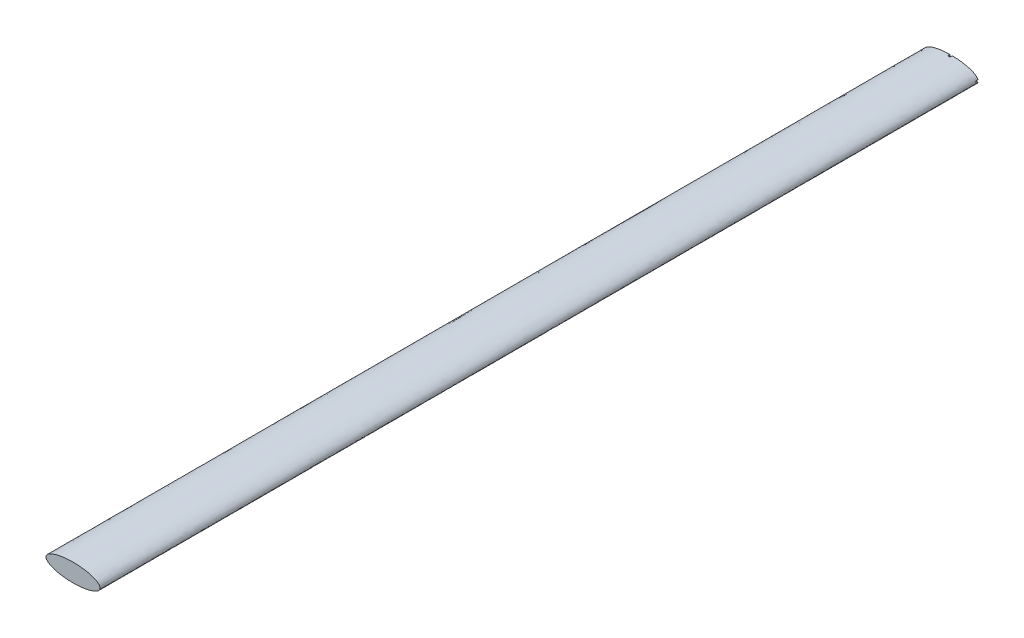
ISO-10303-21;
HEADER;
FILE_DESCRIPTION(('STEP AP214'),'2;1');
FILE_NAME('part.step','',(''),(''),'','','');
FILE_SCHEMA(('AUTOMOTIVE_DESIGN { 1 0 10303 214 1 1 1 1 }'));
ENDSEC;
DATA;
#1=APPLICATION_CONTEXT('core data for automotive mechanical design processes');
#2=APPLICATION_PROTOCOL_DEFINITION('international standard','automotive_design',2000,#1);
#3=PRODUCT_CONTEXT('',#1,'mechanical');
#4=PRODUCT('Part','Part','',(#3));
#5=PRODUCT_RELATED_PRODUCT_CATEGORY('part','',(#4));
#6=PRODUCT_DEFINITION_FORMATION('','',#4);
#7=PRODUCT_DEFINITION_CONTEXT('part definition',#1,'design');
#8=PRODUCT_DEFINITION('design','',#6,#7);
#9=PRODUCT_DEFINITION_SHAPE('','',#8);
#10=(LENGTH_UNIT() NAMED_UNIT(*) SI_UNIT(.MILLI.,.METRE.));
#11=(NAMED_UNIT(*) PLANE_ANGLE_UNIT() SI_UNIT($,.RADIAN.));
#12=(NAMED_UNIT(*) SI_UNIT($,.STERADIAN.) SOLID_ANGLE_UNIT());
#13=UNCERTAINTY_MEASURE_WITH_UNIT(LENGTH_MEASURE(1.E-05),#10,'distance_accuracy_value','');
#14=(GEOMETRIC_REPRESENTATION_CONTEXT(3) GLOBAL_UNCERTAINTY_ASSIGNED_CONTEXT((#13)) GLOBAL_UNIT_ASSIGNED_CONTEXT((#10,
#11,#12)) REPRESENTATION_CONTEXT('',''));
#15=CARTESIAN_POINT('',(0.,0.,0.));
#16=DIRECTION('',(0.,0.,1.));
#17=DIRECTION('',(1.,0.,0.));
#18=AXIS2_PLACEMENT_3D('',#15,#16,#17);
#19=CARTESIAN_POINT('',(0.,0.,0.));
#20=DIRECTION('',(0.,0.,1.));
#21=DIRECTION('',(1.,0.,0.));
#22=AXIS2_PLACEMENT_3D('',#19,#20,#21);
#23=PLANE('',#22);
#24=CARTESIAN_POINT('',(0.,0.,0.));
#25=DIRECTION('',(0.,0.,1.));
#26=DIRECTION('',(-1.,0.,0.));
#27=AXIS2_PLACEMENT_3D('',#24,#25,#26);
#28=ELLIPSE('',#27,12.,4.);
#29=CARTESIAN_POINT('',(11.9058808997907,0.5,0.));
#30=VERTEX_POINT('',#29);
#31=CARTESIAN_POINT('',(0.500000000000001,3.99652626942727,0.));
#32=VERTEX_POINT('',#31);
#33=EDGE_CURVE('E249',#30,#32,#28,.T.);
#34=ORIENTED_EDGE('',*,*,#33,.F.);
#35=DIRECTION('',(1.,0.,0.));
#36=VECTOR('',#35,1.);
#37=CARTESIAN_POINT('',(12.4063244461499,0.5,0.));
#38=LINE('',#37,#36);
#39=CARTESIAN_POINT('',(0.500000000000001,0.5,0.));
#40=VERTEX_POINT('',#39);
#41=EDGE_CURVE('E131',#40,#30,#38,.T.);
#42=ORIENTED_EDGE('',*,*,#41,.F.);
#43=DIRECTION('',(0.,1.,0.));
#44=VECTOR('',#43,1.);
#45=CARTESIAN_POINT('',(0.500000000000001,0.,0.));
#46=LINE('',#45,#44);
#47=EDGE_CURVE('E207',#40,#32,#46,.T.);
#48=ORIENTED_EDGE('',*,*,#47,.T.);
#49=EDGE_LOOP('',(#34,#42,#48));
#50=FACE_BOUND('',#49,.T.);
#51=ADVANCED_FACE('F33',(#50),#23,.F.);
#52=CARTESIAN_POINT('',(-0.499999999999999,3.99652626942727,0.));
#53=VERTEX_POINT('',#52);
#54=CARTESIAN_POINT('',(-11.9058808997907,0.5,0.));
#55=VERTEX_POINT('',#54);
#56=EDGE_CURVE('E192',#53,#55,#28,.T.);
#57=ORIENTED_EDGE('',*,*,#56,.F.);
#58=DIRECTION('',(0.,1.,0.));
#59=VECTOR('',#58,1.);
#60=CARTESIAN_POINT('',(-0.499999999999999,4.92349619167704,0.));
#61=LINE('',#60,#59);
#62=CARTESIAN_POINT('',(-0.499999999999999,0.5,0.));
#63=VERTEX_POINT('',#62);
#64=EDGE_CURVE('E164',#63,#53,#61,.T.);
#65=ORIENTED_EDGE('',*,*,#64,.F.);
#66=DIRECTION('',(-1.,0.,0.));
#67=VECTOR('',#66,1.);
#68=CARTESIAN_POINT('',(0.,0.5,0.));
#69=LINE('',#68,#67);
#70=EDGE_CURVE('E205',#63,#55,#69,.T.);
#71=ORIENTED_EDGE('',*,*,#70,.T.);
#72=EDGE_LOOP('',(#57,#65,#71));
#73=FACE_BOUND('',#72,.T.);
#74=ADVANCED_FACE('F236',(#73),#23,.F.);
#75=CARTESIAN_POINT('',(-11.9058808997907,-0.5,0.));
#76=VERTEX_POINT('',#75);
#77=CARTESIAN_POINT('',(-0.499999999999999,-3.99652626942727,0.));
#78=VERTEX_POINT('',#77);
#79=EDGE_CURVE('E197',#76,#78,#28,.T.);
#80=ORIENTED_EDGE('',*,*,#79,.F.);
#81=DIRECTION('',(-1.,0.,0.));
#82=VECTOR('',#81,1.);
#83=CARTESIAN_POINT('',(-0.499999999999999,-0.5,0.));
#84=LINE('',#83,#82);
#85=CARTESIAN_POINT('',(-0.499999999999999,-0.5,0.));
#86=VERTEX_POINT('',#85);
#87=EDGE_CURVE('E162',#86,#76,#84,.T.);
#88=ORIENTED_EDGE('',*,*,#87,.F.);
#89=DIRECTION('',(0.,-1.,0.));
#90=VECTOR('',#89,1.);
#91=CARTESIAN_POINT('',(-0.499999999999999,0.,0.));
#92=LINE('',#91,#90);
#93=EDGE_CURVE('E202',#86,#78,#92,.T.);
#94=ORIENTED_EDGE('',*,*,#93,.T.);
#95=EDGE_LOOP('',(#80,#88,#94));
#96=FACE_BOUND('',#95,.T.);
#97=ADVANCED_FACE('F226',(#96),#23,.F.);
#98=CARTESIAN_POINT('',(0.,0.,390.));
#99=DIRECTION('',(0.,0.,1.));
#100=DIRECTION('',(-1.,0.,0.));
#101=AXIS2_PLACEMENT_3D('',#98,#99,#100);
#102=ELLIPSE('',#101,12.,4.);
#103=DIRECTION('',(0.,0.,-1.));
#104=VECTOR('',#103,1.);
#105=SURFACE_OF_LINEAR_EXTRUSION('',#102,#104);
#106=ORIENTED_EDGE('',*,*,#33,.T.);
#107=DIRECTION('',(0.,0.,-1.));
#108=VECTOR('',#107,1.);
#109=CARTESIAN_POINT('',(0.500000000000001,3.99652626942727,390.));
#110=LINE('',#109,#108);
#111=CARTESIAN_POINT('',(0.500000000000001,3.99652626942727,1.));
#112=VERTEX_POINT('',#111);
#113=EDGE_CURVE('E189',#32,#112,#110,.F.);
#114=ORIENTED_EDGE('',*,*,#113,.T.);
#115=CARTESIAN_POINT('',(0.,0.,1.));
#116=DIRECTION('',(0.,0.,1.));
#117=DIRECTION('',(-1.,0.,0.));
#118=AXIS2_PLACEMENT_3D('',#115,#116,#117);
#119=ELLIPSE('',#118,12.,4.);
#120=CARTESIAN_POINT('',(-0.499999999999999,3.99652626942727,1.));
#121=VERTEX_POINT('',#120);
#122=EDGE_CURVE('E11',#121,#112,#119,.F.);
#123=ORIENTED_EDGE('',*,*,#122,.F.);
#124=DIRECTION('',(0.,0.,-1.));
#125=VECTOR('',#124,1.);
#126=CARTESIAN_POINT('',(-0.499999999999999,3.99652626942727,390.));
#127=LINE('',#126,#125);
#128=EDGE_CURVE('E186',#121,#53,#127,.T.);
#129=ORIENTED_EDGE('',*,*,#128,.T.);
#130=ORIENTED_EDGE('',*,*,#56,.T.);
#131=DIRECTION('',(0.,0.,-1.));
#132=VECTOR('',#131,1.);
#133=CARTESIAN_POINT('',(-11.9058808997907,0.5,390.));
#134=LINE('',#133,#132);
#135=CARTESIAN_POINT('',(-11.9058808997907,0.5,1.));
#136=VERTEX_POINT('',#135);
#137=EDGE_CURVE('E183',#55,#136,#134,.F.);
#138=ORIENTED_EDGE('',*,*,#137,.T.);
#139=CARTESIAN_POINT('',(-11.9058808997907,-0.5,1.));
#140=VERTEX_POINT('',#139);
#141=EDGE_CURVE('E38',#140,#136,#119,.F.);
#142=ORIENTED_EDGE('',*,*,#141,.F.);
#143=DIRECTION('',(0.,0.,-1.));
#144=VECTOR('',#143,1.);
#145=CARTESIAN_POINT('',(-11.9058808997907,-0.5,390.));
#146=LINE('',#145,#144);
#147=EDGE_CURVE('E180',#140,#76,#146,.T.);
#148=ORIENTED_EDGE('',*,*,#147,.T.);
#149=ORIENTED_EDGE('',*,*,#79,.T.);
#150=DIRECTION('',(0.,0.,-1.));
#151=VECTOR('',#150,1.);
#152=CARTESIAN_POINT('',(-0.499999999999999,-3.99652626942727,390.));
#153=LINE('',#152,#151);
#154=CARTESIAN_POINT('',(-0.499999999999999,-3.99652626942727,1.));
#155=VERTEX_POINT('',#154);
#156=EDGE_CURVE('E177',#78,#155,#153,.F.);
#157=ORIENTED_EDGE('',*,*,#156,.T.);
#158=CARTESIAN_POINT('',(0.500000000000001,-3.99652626942727,1.));
#159=VERTEX_POINT('',#158);
#160=EDGE_CURVE('E213',#159,#155,#119,.F.);
#161=ORIENTED_EDGE('',*,*,#160,.F.);
#162=DIRECTION('',(0.,0.,-1.));
#163=VECTOR('',#162,1.);
#164=CARTESIAN_POINT('',(0.500000000000001,-3.99652626942727,390.));
#165=LINE('',#164,#163);
#166=CARTESIAN_POINT('',(0.500000000000001,-3.99652626942727,0.));
#167=VERTEX_POINT('',#166);
#168=EDGE_CURVE('E144',#159,#167,#165,.T.);
#169=ORIENTED_EDGE('',*,*,#168,.T.);
#170=CARTESIAN_POINT('',(11.9058808997907,-0.5,0.));
#171=VERTEX_POINT('',#170);
#172=EDGE_CURVE('E200',#167,#171,#28,.T.);
#173=ORIENTED_EDGE('',*,*,#172,.T.);
#174=DIRECTION('',(0.,0.,-1.));
#175=VECTOR('',#174,1.);
#176=CARTESIAN_POINT('',(11.9058808997907,-0.5,390.));
#177=LINE('',#176,#175);
#178=CARTESIAN_POINT('',(11.9058808997907,-0.5,1.));
#179=VERTEX_POINT('',#178);
#180=EDGE_CURVE('E50',#171,#179,#177,.F.);
#181=ORIENTED_EDGE('',*,*,#180,.T.);
#182=CARTESIAN_POINT('',(11.9058808997907,0.5,1.));
#183=VERTEX_POINT('',#182);
#184=EDGE_CURVE('E43',#183,#179,#119,.F.);
#185=ORIENTED_EDGE('',*,*,#184,.F.);
#186=DIRECTION('',(0.,0.,-1.));
#187=VECTOR('',#186,1.);
#188=CARTESIAN_POINT('',(11.9058808997907,0.5,390.));
#189=LINE('',#188,#187);
#190=EDGE_CURVE('E58',#183,#30,#189,.T.);
#191=ORIENTED_EDGE('',*,*,#190,.T.);
#192=EDGE_LOOP('',(#106,#114,#123,#129,#130,#138,#142,#148,#149,#157,#161,#169,#173,#181,#185,#191));
#193=FACE_BOUND('',#192,.T.);
#194=CARTESIAN_POINT('',(-12.,0.,390.));
#195=VERTEX_POINT('',#194);
#196=EDGE_CURVE('E193',#195,#195,#102,.T.);
#197=ORIENTED_EDGE('',*,*,#196,.F.);
#198=EDGE_LOOP('',(#197));
#199=FACE_BOUND('',#198,.T.);
#200=ADVANCED_FACE('F35',(#193,#199),#105,.F.);
#201=CARTESIAN_POINT('',(0.,0.,390.));
#202=DIRECTION('',(0.,0.,1.));
#203=DIRECTION('',(1.,0.,0.));
#204=AXIS2_PLACEMENT_3D('',#201,#202,#203);
#205=PLANE('',#204);
#206=ORIENTED_EDGE('',*,*,#196,.T.);
#207=EDGE_LOOP('',(#206));
#208=FACE_BOUND('',#207,.T.);
#209=ADVANCED_FACE('F258',(#208),#205,.T.);
#210=ORIENTED_EDGE('',*,*,#172,.F.);
#211=DIRECTION('',(0.,-1.,0.));
#212=VECTOR('',#211,1.);
#213=CARTESIAN_POINT('',(0.500000000000001,-0.5,0.));
#214=LINE('',#213,#212);
#215=CARTESIAN_POINT('',(0.500000000000001,-0.5,0.));
#216=VERTEX_POINT('',#215);
#217=EDGE_CURVE('E160',#216,#167,#214,.T.);
#218=ORIENTED_EDGE('',*,*,#217,.F.);
#219=DIRECTION('',(1.,0.,0.));
#220=VECTOR('',#219,1.);
#221=CARTESIAN_POINT('',(0.,-0.5,0.));
#222=LINE('',#221,#220);
#223=EDGE_CURVE('E136',#216,#171,#222,.T.);
#224=ORIENTED_EDGE('',*,*,#223,.T.);
#225=EDGE_LOOP('',(#210,#218,#224));
#226=FACE_BOUND('',#225,.T.);
#227=ADVANCED_FACE('F251',(#226),#23,.F.);
#228=CARTESIAN_POINT('',(12.4063244461499,-0.5,1.));
#229=DIRECTION('',(0.,0.,-1.));
#230=DIRECTION('',(-1.,0.,0.));
#231=AXIS2_PLACEMENT_3D('',#228,#229,#230);
#232=PLANE('',#231);
#233=ORIENTED_EDGE('',*,*,#122,.T.);
#234=DIRECTION('',(0.,-1.,0.));
#235=VECTOR('',#234,1.);
#236=CARTESIAN_POINT('',(0.500000000000001,4.92349619167704,1.));
#237=LINE('',#236,#235);
#238=CARTESIAN_POINT('',(0.500000000000001,0.5,1.));
#239=VERTEX_POINT('',#238);
#240=EDGE_CURVE('E157',#112,#239,#237,.T.);
#241=ORIENTED_EDGE('',*,*,#240,.T.);
#242=DIRECTION('',(1.,0.,0.));
#243=VECTOR('',#242,1.);
#244=CARTESIAN_POINT('',(12.4063244461499,0.5,1.));
#245=LINE('',#244,#243);
#246=EDGE_CURVE('E140',#239,#183,#245,.T.);
#247=ORIENTED_EDGE('',*,*,#246,.T.);
#248=ORIENTED_EDGE('',*,*,#184,.T.);
#249=DIRECTION('',(-1.,0.,0.));
#250=VECTOR('',#249,1.);
#251=CARTESIAN_POINT('',(12.4063244461499,-0.5,1.));
#252=LINE('',#251,#250);
#253=CARTESIAN_POINT('',(0.500000000000001,-0.5,1.));
#254=VERTEX_POINT('',#253);
#255=EDGE_CURVE('E124',#179,#254,#252,.T.);
#256=ORIENTED_EDGE('',*,*,#255,.T.);
#257=DIRECTION('',(0.,-1.,0.));
#258=VECTOR('',#257,1.);
#259=CARTESIAN_POINT('',(0.500000000000001,-0.5,1.));
#260=LINE('',#259,#258);
#261=EDGE_CURVE('E128',#254,#159,#260,.T.);
#262=ORIENTED_EDGE('',*,*,#261,.T.);
#263=ORIENTED_EDGE('',*,*,#160,.T.);
#264=DIRECTION('',(0.,1.,0.));
#265=VECTOR('',#264,1.);
#266=CARTESIAN_POINT('',(-0.499999999999999,-0.5,1.));
#267=LINE('',#266,#265);
#268=CARTESIAN_POINT('',(-0.499999999999999,-0.5,1.));
#269=VERTEX_POINT('',#268);
#270=EDGE_CURVE('E145',#155,#269,#267,.T.);
#271=ORIENTED_EDGE('',*,*,#270,.T.);
#272=DIRECTION('',(-1.,0.,0.));
#273=VECTOR('',#272,1.);
#274=CARTESIAN_POINT('',(-0.499999999999999,-0.5,1.));
#275=LINE('',#274,#273);
#276=EDGE_CURVE('E147',#269,#140,#275,.T.);
#277=ORIENTED_EDGE('',*,*,#276,.T.);
#278=ORIENTED_EDGE('',*,*,#141,.T.);
#279=DIRECTION('',(1.,0.,0.));
#280=VECTOR('',#279,1.);
#281=CARTESIAN_POINT('',(-0.499999999999999,0.5,1.));
#282=LINE('',#281,#280);
#283=CARTESIAN_POINT('',(-0.499999999999999,0.5,1.));
#284=VERTEX_POINT('',#283);
#285=EDGE_CURVE('E152',#136,#284,#282,.T.);
#286=ORIENTED_EDGE('',*,*,#285,.T.);
#287=DIRECTION('',(0.,1.,0.));
#288=VECTOR('',#287,1.);
#289=CARTESIAN_POINT('',(-0.499999999999999,4.92349619167704,1.));
#290=LINE('',#289,#288);
#291=EDGE_CURVE('E154',#284,#121,#290,.T.);
#292=ORIENTED_EDGE('',*,*,#291,.T.);
#293=EDGE_LOOP('',(#233,#241,#247,#248,#256,#262,#263,#271,#277,#278,#286,#292));
#294=FACE_BOUND('',#293,.T.);
#295=ADVANCED_FACE('F126',(#294),#232,.T.);
#296=CARTESIAN_POINT('',(12.4063244461499,0.5,1.));
#297=DIRECTION('',(0.,1.,0.));
#298=DIRECTION('',(-1.,0.,0.));
#299=AXIS2_PLACEMENT_3D('',#296,#297,#298);
#300=PLANE('',#299);
#301=ORIENTED_EDGE('',*,*,#246,.F.);
#302=DIRECTION('',(0.,0.,-1.));
#303=VECTOR('',#302,1.);
#304=CARTESIAN_POINT('',(0.500000000000001,0.5,1.));
#305=LINE('',#304,#303);
#306=EDGE_CURVE('E167',#239,#40,#305,.T.);
#307=ORIENTED_EDGE('',*,*,#306,.T.);
#308=ORIENTED_EDGE('',*,*,#41,.T.);
#309=ORIENTED_EDGE('',*,*,#190,.F.);
#310=EDGE_LOOP('',(#301,#307,#308,#309));
#311=FACE_BOUND('',#310,.T.);
#312=ADVANCED_FACE('F245',(#311),#300,.F.);
#313=CARTESIAN_POINT('',(0.500000000000001,4.92349619167704,1.));
#314=DIRECTION('',(1.,0.,0.));
#315=DIRECTION('',(0.,1.,0.));
#316=AXIS2_PLACEMENT_3D('',#313,#314,#315);
#317=PLANE('',#316);
#318=ORIENTED_EDGE('',*,*,#47,.F.);
#319=ORIENTED_EDGE('',*,*,#306,.F.);
#320=ORIENTED_EDGE('',*,*,#240,.F.);
#321=ORIENTED_EDGE('',*,*,#113,.F.);
#322=EDGE_LOOP('',(#318,#319,#320,#321));
#323=FACE_BOUND('',#322,.T.);
#324=ADVANCED_FACE('F244',(#323),#317,.F.);
#325=CARTESIAN_POINT('',(-0.499999999999999,4.92349619167704,1.));
#326=DIRECTION('',(-1.,0.,0.));
#327=DIRECTION('',(0.,-1.,0.));
#328=AXIS2_PLACEMENT_3D('',#325,#326,#327);
#329=PLANE('',#328);
#330=ORIENTED_EDGE('',*,*,#291,.F.);
#331=DIRECTION('',(0.,0.,-1.));
#332=VECTOR('',#331,1.);
#333=CARTESIAN_POINT('',(-0.499999999999999,0.5,1.));
#334=LINE('',#333,#332);
#335=EDGE_CURVE('E170',#284,#63,#334,.T.);
#336=ORIENTED_EDGE('',*,*,#335,.T.);
#337=ORIENTED_EDGE('',*,*,#64,.T.);
#338=ORIENTED_EDGE('',*,*,#128,.F.);
#339=EDGE_LOOP('',(#330,#336,#337,#338));
#340=FACE_BOUND('',#339,.T.);
#341=ADVANCED_FACE('F239',(#340),#329,.F.);
#342=CARTESIAN_POINT('',(-0.499999999999999,0.5,1.));
#343=DIRECTION('',(0.,1.,0.));
#344=DIRECTION('',(-1.,0.,0.));
#345=AXIS2_PLACEMENT_3D('',#342,#343,#344);
#346=PLANE('',#345);
#347=ORIENTED_EDGE('',*,*,#70,.F.);
#348=ORIENTED_EDGE('',*,*,#335,.F.);
#349=ORIENTED_EDGE('',*,*,#285,.F.);
#350=ORIENTED_EDGE('',*,*,#137,.F.);
#351=EDGE_LOOP('',(#347,#348,#349,#350));
#352=FACE_BOUND('',#351,.T.);
#353=ADVANCED_FACE('F232',(#352),#346,.F.);
#354=CARTESIAN_POINT('',(-0.499999999999999,-0.5,1.));
#355=DIRECTION('',(0.,-1.,0.));
#356=DIRECTION('',(1.,0.,0.));
#357=AXIS2_PLACEMENT_3D('',#354,#355,#356);
#358=PLANE('',#357);
#359=ORIENTED_EDGE('',*,*,#276,.F.);
#360=DIRECTION('',(0.,0.,-1.));
#361=VECTOR('',#360,1.);
#362=CARTESIAN_POINT('',(-0.499999999999999,-0.5,1.));
#363=LINE('',#362,#361);
#364=EDGE_CURVE('E139',#269,#86,#363,.T.);
#365=ORIENTED_EDGE('',*,*,#364,.T.);
#366=ORIENTED_EDGE('',*,*,#87,.T.);
#367=ORIENTED_EDGE('',*,*,#147,.F.);
#368=EDGE_LOOP('',(#359,#365,#366,#367));
#369=FACE_BOUND('',#368,.T.);
#370=ADVANCED_FACE('F228',(#369),#358,.F.);
#371=CARTESIAN_POINT('',(-0.499999999999999,-0.5,1.));
#372=DIRECTION('',(-1.,0.,0.));
#373=DIRECTION('',(0.,-1.,0.));
#374=AXIS2_PLACEMENT_3D('',#371,#372,#373);
#375=PLANE('',#374);
#376=ORIENTED_EDGE('',*,*,#93,.F.);
#377=ORIENTED_EDGE('',*,*,#364,.F.);
#378=ORIENTED_EDGE('',*,*,#270,.F.);
#379=ORIENTED_EDGE('',*,*,#156,.F.);
#380=EDGE_LOOP('',(#376,#377,#378,#379));
#381=FACE_BOUND('',#380,.T.);
#382=ADVANCED_FACE('F220',(#381),#375,.F.);
#383=CARTESIAN_POINT('',(0.500000000000001,-0.5,1.));
#384=DIRECTION('',(1.,0.,0.));
#385=DIRECTION('',(0.,1.,0.));
#386=AXIS2_PLACEMENT_3D('',#383,#384,#385);
#387=PLANE('',#386);
#388=ORIENTED_EDGE('',*,*,#261,.F.);
#389=DIRECTION('',(0.,0.,-1.));
#390=VECTOR('',#389,1.);
#391=CARTESIAN_POINT('',(0.500000000000001,-0.5,1.));
#392=LINE('',#391,#390);
#393=EDGE_CURVE('E134',#254,#216,#392,.T.);
#394=ORIENTED_EDGE('',*,*,#393,.T.);
#395=ORIENTED_EDGE('',*,*,#217,.T.);
#396=ORIENTED_EDGE('',*,*,#168,.F.);
#397=EDGE_LOOP('',(#388,#394,#395,#396));
#398=FACE_BOUND('',#397,.T.);
#399=ADVANCED_FACE('F142',(#398),#387,.F.);
#400=CARTESIAN_POINT('',(12.4063244461499,-0.5,1.));
#401=DIRECTION('',(0.,-1.,0.));
#402=DIRECTION('',(1.,0.,0.));
#403=AXIS2_PLACEMENT_3D('',#400,#401,#402);
#404=PLANE('',#403);
#405=ORIENTED_EDGE('',*,*,#223,.F.);
#406=ORIENTED_EDGE('',*,*,#393,.F.);
#407=ORIENTED_EDGE('',*,*,#255,.F.);
#408=ORIENTED_EDGE('',*,*,#180,.F.);
#409=EDGE_LOOP('',(#405,#406,#407,#408));
#410=FACE_BOUND('',#409,.T.);
#411=ADVANCED_FACE('F135',(#410),#404,.F.);
#412=CLOSED_SHELL('',(#51,#74,#97,#200,#209,#227,#295,#312,#324,#341,#353,#370,#382,#399,#411));
#413=MANIFOLD_SOLID_BREP('B2',#412);
#414=ADVANCED_BREP_SHAPE_REPRESENTATION('',(#18,#413),#14);
#415=SHAPE_DEFINITION_REPRESENTATION(#9,#414);
ENDSEC;
END-ISO-10303-21;
